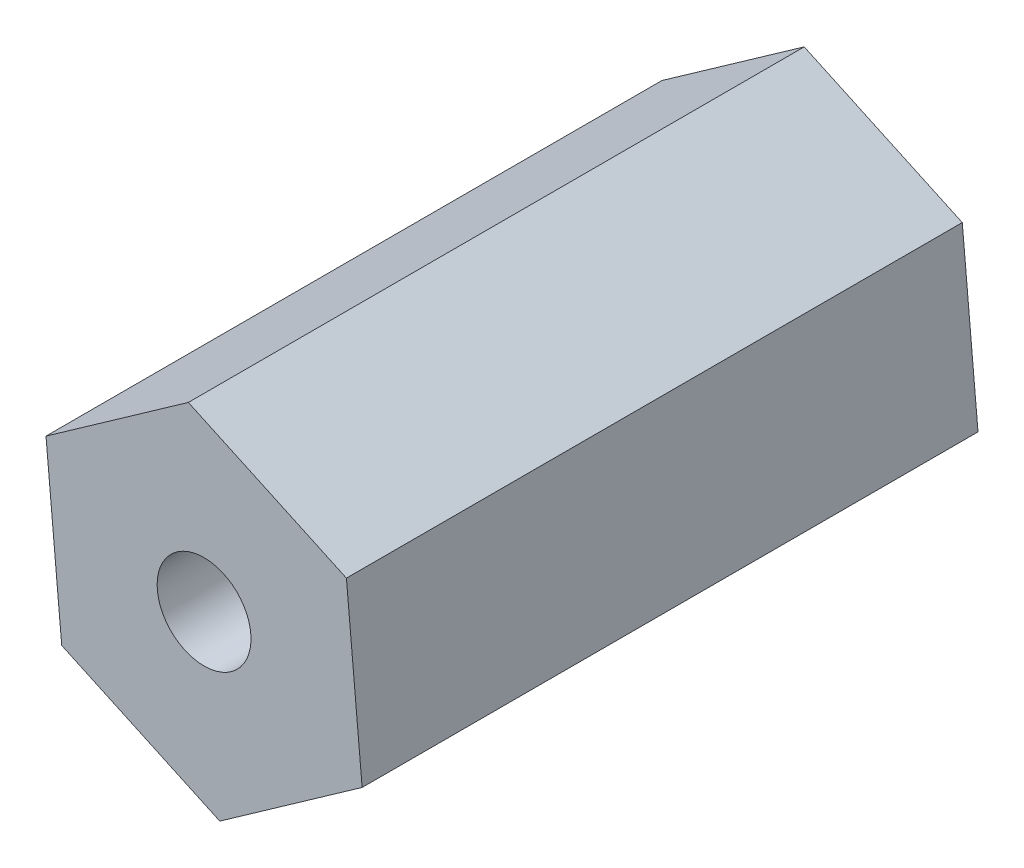
ISO-10303-21;
HEADER;
FILE_DESCRIPTION(('STEP AP214'),'2;1');
FILE_NAME('part.step','',(''),(''),'','','');
FILE_SCHEMA(('AUTOMOTIVE_DESIGN { 1 0 10303 214 1 1 1 1 }'));
ENDSEC;
DATA;
#1=APPLICATION_CONTEXT('core data for automotive mechanical design processes');
#2=APPLICATION_PROTOCOL_DEFINITION('international standard','automotive_design',2000,#1);
#3=PRODUCT_CONTEXT('',#1,'mechanical');
#4=PRODUCT('Part','Part','',(#3));
#5=PRODUCT_RELATED_PRODUCT_CATEGORY('part','',(#4));
#6=PRODUCT_DEFINITION_FORMATION('','',#4);
#7=PRODUCT_DEFINITION_CONTEXT('part definition',#1,'design');
#8=PRODUCT_DEFINITION('design','',#6,#7);
#9=PRODUCT_DEFINITION_SHAPE('','',#8);
#10=(LENGTH_UNIT() NAMED_UNIT(*) SI_UNIT(.MILLI.,.METRE.));
#11=(NAMED_UNIT(*) PLANE_ANGLE_UNIT() SI_UNIT($,.RADIAN.));
#12=(NAMED_UNIT(*) SI_UNIT($,.STERADIAN.) SOLID_ANGLE_UNIT());
#13=UNCERTAINTY_MEASURE_WITH_UNIT(LENGTH_MEASURE(1.E-05),#10,'distance_accuracy_value','');
#14=(GEOMETRIC_REPRESENTATION_CONTEXT(3) GLOBAL_UNCERTAINTY_ASSIGNED_CONTEXT((#13)) GLOBAL_UNIT_ASSIGNED_CONTEXT((#10,
#11,#12)) REPRESENTATION_CONTEXT('',''));
#15=CARTESIAN_POINT('',(0.,0.,0.));
#16=DIRECTION('',(0.,0.,1.));
#17=DIRECTION('',(1.,0.,0.));
#18=AXIS2_PLACEMENT_3D('',#15,#16,#17);
#19=CARTESIAN_POINT('',(1.32877783409409,-14.6646968374165,52.07));
#20=DIRECTION('',(-0.57611094710688,0.817371504656,0.));
#21=DIRECTION('',(-0.817371504656,-0.57611094710688,0.));
#22=AXIS2_PLACEMENT_3D('',#19,#20,#21);
#23=PLANE('',#22);
#24=DIRECTION('',(0.817371504656,0.57611094710688,0.));
#25=VECTOR('',#24,1.);
#26=CARTESIAN_POINT('',(1.32877783409409,-14.6646968374165,0.));
#27=LINE('',#26,#25);
#28=CARTESIAN_POINT('',(1.32877783409409,-14.6646968374165,0.));
#29=VERTEX_POINT('',#28);
#30=CARTESIAN_POINT('',(13.364388917047,-6.18159305839709,0.));
#31=VERTEX_POINT('',#30);
#32=EDGE_CURVE('E119',#29,#31,#27,.T.);
#33=ORIENTED_EDGE('',*,*,#32,.T.);
#34=DIRECTION('',(0.,0.,-1.));
#35=VECTOR('',#34,1.);
#36=CARTESIAN_POINT('',(13.364388917047,-6.18159305839709,52.07));
#37=LINE('',#36,#35);
#38=CARTESIAN_POINT('',(13.364388917047,-6.18159305839709,52.07));
#39=VERTEX_POINT('',#38);
#40=EDGE_CURVE('E11',#39,#31,#37,.T.);
#41=ORIENTED_EDGE('',*,*,#40,.F.);
#42=DIRECTION('',(0.817371504656,0.57611094710688,0.));
#43=VECTOR('',#42,1.);
#44=CARTESIAN_POINT('',(1.32877783409409,-14.6646968374165,52.07));
#45=LINE('',#44,#43);
#46=CARTESIAN_POINT('',(1.32877783409409,-14.6646968374165,52.07));
#47=VERTEX_POINT('',#46);
#48=EDGE_CURVE('E130',#47,#39,#45,.T.);
#49=ORIENTED_EDGE('',*,*,#48,.F.);
#50=DIRECTION('',(0.,0.,-1.));
#51=VECTOR('',#50,1.);
#52=CARTESIAN_POINT('',(1.32877783409409,-14.6646968374165,52.07));
#53=LINE('',#52,#51);
#54=EDGE_CURVE('E115',#47,#29,#53,.T.);
#55=ORIENTED_EDGE('',*,*,#54,.T.);
#56=EDGE_LOOP('',(#33,#41,#49,#55));
#57=FACE_BOUND('',#56,.T.);
#58=ADVANCED_FACE('F35',(#57),#23,.F.);
#59=CARTESIAN_POINT('',(13.364388917047,-6.18159305839709,52.07));
#60=DIRECTION('',(-0.995919960915047,-0.0902409632648711,0.));
#61=DIRECTION('',(0.0902409632648711,-0.995919960915047,0.));
#62=AXIS2_PLACEMENT_3D('',#59,#60,#61);
#63=PLANE('',#62);
#64=DIRECTION('',(-0.0902409632648711,0.995919960915047,0.));
#65=VECTOR('',#64,1.);
#66=CARTESIAN_POINT('',(13.364388917047,-6.18159305839709,0.));
#67=LINE('',#66,#65);
#68=CARTESIAN_POINT('',(12.035611082953,8.48310377901941,0.));
#69=VERTEX_POINT('',#68);
#70=EDGE_CURVE('E122',#31,#69,#67,.T.);
#71=ORIENTED_EDGE('',*,*,#70,.T.);
#72=DIRECTION('',(0.,0.,-1.));
#73=VECTOR('',#72,1.);
#74=CARTESIAN_POINT('',(12.035611082953,8.48310377901941,52.07));
#75=LINE('',#74,#73);
#76=CARTESIAN_POINT('',(12.035611082953,8.48310377901941,52.07));
#77=VERTEX_POINT('',#76);
#78=EDGE_CURVE('E43',#77,#69,#75,.T.);
#79=ORIENTED_EDGE('',*,*,#78,.F.);
#80=DIRECTION('',(-0.0902409632648711,0.995919960915047,0.));
#81=VECTOR('',#80,1.);
#82=CARTESIAN_POINT('',(13.364388917047,-6.18159305839709,52.07));
#83=LINE('',#82,#81);
#84=EDGE_CURVE('E88',#39,#77,#83,.T.);
#85=ORIENTED_EDGE('',*,*,#84,.F.);
#86=ORIENTED_EDGE('',*,*,#40,.T.);
#87=EDGE_LOOP('',(#71,#79,#85,#86));
#88=FACE_BOUND('',#87,.T.);
#89=ADVANCED_FACE('F155',(#88),#63,.F.);
#90=CARTESIAN_POINT('',(12.035611082953,8.48310377901941,52.07));
#91=DIRECTION('',(-0.419809013808167,-0.907612467920871,0.));
#92=DIRECTION('',(0.907612467920871,-0.419809013808167,0.));
#93=AXIS2_PLACEMENT_3D('',#90,#91,#92);
#94=PLANE('',#93);
#95=DIRECTION('',(-0.907612467920871,0.419809013808167,0.));
#96=VECTOR('',#95,1.);
#97=CARTESIAN_POINT('',(12.035611082953,8.48310377901941,0.));
#98=LINE('',#97,#96);
#99=CARTESIAN_POINT('',(-1.3287778340941,14.6646968374165,0.));
#100=VERTEX_POINT('',#99);
#101=EDGE_CURVE('E125',#69,#100,#98,.T.);
#102=ORIENTED_EDGE('',*,*,#101,.T.);
#103=DIRECTION('',(0.,0.,-1.));
#104=VECTOR('',#103,1.);
#105=CARTESIAN_POINT('',(-1.3287778340941,14.6646968374165,52.07));
#106=LINE('',#105,#104);
#107=CARTESIAN_POINT('',(-1.3287778340941,14.6646968374165,52.07));
#108=VERTEX_POINT('',#107);
#109=EDGE_CURVE('E110',#108,#100,#106,.T.);
#110=ORIENTED_EDGE('',*,*,#109,.F.);
#111=DIRECTION('',(-0.907612467920871,0.419809013808167,0.));
#112=VECTOR('',#111,1.);
#113=CARTESIAN_POINT('',(12.035611082953,8.48310377901941,52.07));
#114=LINE('',#113,#112);
#115=EDGE_CURVE('E101',#77,#108,#114,.T.);
#116=ORIENTED_EDGE('',*,*,#115,.F.);
#117=ORIENTED_EDGE('',*,*,#78,.T.);
#118=EDGE_LOOP('',(#102,#110,#116,#117));
#119=FACE_BOUND('',#118,.T.);
#120=ADVANCED_FACE('F136',(#119),#94,.F.);
#121=CARTESIAN_POINT('',(-1.3287778340941,14.6646968374165,52.07));
#122=DIRECTION('',(0.57611094710688,-0.817371504656,0.));
#123=DIRECTION('',(0.817371504656,0.57611094710688,0.));
#124=AXIS2_PLACEMENT_3D('',#121,#122,#123);
#125=PLANE('',#124);
#126=DIRECTION('',(-0.817371504656,-0.57611094710688,0.));
#127=VECTOR('',#126,1.);
#128=CARTESIAN_POINT('',(-1.3287778340941,14.6646968374165,0.));
#129=LINE('',#128,#127);
#130=CARTESIAN_POINT('',(-13.3643889170471,6.1815930583971,0.));
#131=VERTEX_POINT('',#130);
#132=EDGE_CURVE('E109',#100,#131,#129,.T.);
#133=ORIENTED_EDGE('',*,*,#132,.T.);
#134=DIRECTION('',(0.,0.,-1.));
#135=VECTOR('',#134,1.);
#136=CARTESIAN_POINT('',(-13.3643889170471,6.1815930583971,52.07));
#137=LINE('',#136,#135);
#138=CARTESIAN_POINT('',(-13.3643889170471,6.1815930583971,52.07));
#139=VERTEX_POINT('',#138);
#140=EDGE_CURVE('E106',#139,#131,#137,.T.);
#141=ORIENTED_EDGE('',*,*,#140,.F.);
#142=DIRECTION('',(-0.817371504656,-0.57611094710688,0.));
#143=VECTOR('',#142,1.);
#144=CARTESIAN_POINT('',(-1.3287778340941,14.6646968374165,52.07));
#145=LINE('',#144,#143);
#146=EDGE_CURVE('E95',#108,#139,#145,.T.);
#147=ORIENTED_EDGE('',*,*,#146,.F.);
#148=ORIENTED_EDGE('',*,*,#109,.T.);
#149=EDGE_LOOP('',(#133,#141,#147,#148));
#150=FACE_BOUND('',#149,.T.);
#151=ADVANCED_FACE('F107',(#150),#125,.F.);
#152=CARTESIAN_POINT('',(-13.3643889170471,6.1815930583971,52.07));
#153=DIRECTION('',(0.995919960915047,0.0902409632648709,0.));
#154=DIRECTION('',(-0.0902409632648709,0.995919960915047,0.));
#155=AXIS2_PLACEMENT_3D('',#152,#153,#154);
#156=PLANE('',#155);
#157=DIRECTION('',(0.0902409632648709,-0.995919960915047,0.));
#158=VECTOR('',#157,1.);
#159=CARTESIAN_POINT('',(-13.3643889170471,6.1815930583971,0.));
#160=LINE('',#159,#158);
#161=CARTESIAN_POINT('',(-12.035611082953,-8.4831037790194,0.));
#162=VERTEX_POINT('',#161);
#163=EDGE_CURVE('E74',#131,#162,#160,.T.);
#164=ORIENTED_EDGE('',*,*,#163,.T.);
#165=DIRECTION('',(0.,0.,-1.));
#166=VECTOR('',#165,1.);
#167=CARTESIAN_POINT('',(-12.035611082953,-8.4831037790194,52.07));
#168=LINE('',#167,#166);
#169=CARTESIAN_POINT('',(-12.035611082953,-8.4831037790194,52.07));
#170=VERTEX_POINT('',#169);
#171=EDGE_CURVE('E111',#170,#162,#168,.T.);
#172=ORIENTED_EDGE('',*,*,#171,.F.);
#173=DIRECTION('',(0.0902409632648709,-0.995919960915047,0.));
#174=VECTOR('',#173,1.);
#175=CARTESIAN_POINT('',(-13.3643889170471,6.1815930583971,52.07));
#176=LINE('',#175,#174);
#177=EDGE_CURVE('E99',#139,#170,#176,.T.);
#178=ORIENTED_EDGE('',*,*,#177,.F.);
#179=ORIENTED_EDGE('',*,*,#140,.T.);
#180=EDGE_LOOP('',(#164,#172,#178,#179));
#181=FACE_BOUND('',#180,.T.);
#182=ADVANCED_FACE('F113',(#181),#156,.F.);
#183=CARTESIAN_POINT('',(-12.035611082953,-8.4831037790194,52.07));
#184=DIRECTION('',(0.419809013808167,0.907612467920871,0.));
#185=DIRECTION('',(-0.907612467920871,0.419809013808167,0.));
#186=AXIS2_PLACEMENT_3D('',#183,#184,#185);
#187=PLANE('',#186);
#188=DIRECTION('',(0.907612467920871,-0.419809013808167,0.));
#189=VECTOR('',#188,1.);
#190=CARTESIAN_POINT('',(-12.035611082953,-8.4831037790194,0.));
#191=LINE('',#190,#189);
#192=EDGE_CURVE('E80',#162,#29,#191,.T.);
#193=ORIENTED_EDGE('',*,*,#192,.T.);
#194=ORIENTED_EDGE('',*,*,#54,.F.);
#195=DIRECTION('',(0.907612467920871,-0.419809013808167,0.));
#196=VECTOR('',#195,1.);
#197=CARTESIAN_POINT('',(-12.035611082953,-8.4831037790194,52.07));
#198=LINE('',#197,#196);
#199=EDGE_CURVE('E51',#170,#47,#198,.T.);
#200=ORIENTED_EDGE('',*,*,#199,.F.);
#201=ORIENTED_EDGE('',*,*,#171,.T.);
#202=EDGE_LOOP('',(#193,#194,#200,#201));
#203=FACE_BOUND('',#202,.T.);
#204=ADVANCED_FACE('F143',(#203),#187,.F.);
#205=CARTESIAN_POINT('',(0.,0.,52.07));
#206=DIRECTION('',(0.,0.,1.));
#207=DIRECTION('',(1.,0.,0.));
#208=AXIS2_PLACEMENT_3D('',#205,#206,#207);
#209=PLANE('',#208);
#210=CARTESIAN_POINT('',(0.,0.,52.07));
#211=DIRECTION('',(0.,0.,-1.));
#212=DIRECTION('',(-1.,0.,0.));
#213=AXIS2_PLACEMENT_3D('',#210,#211,#212);
#214=CIRCLE('',#213,3.96875);
#215=CARTESIAN_POINT('',(-3.96875,0.,52.07));
#216=VERTEX_POINT('',#215);
#217=EDGE_CURVE('E123',#216,#216,#214,.T.);
#218=ORIENTED_EDGE('',*,*,#217,.T.);
#219=EDGE_LOOP('',(#218));
#220=FACE_BOUND('',#219,.T.);
#221=ORIENTED_EDGE('',*,*,#48,.T.);
#222=ORIENTED_EDGE('',*,*,#84,.T.);
#223=ORIENTED_EDGE('',*,*,#115,.T.);
#224=ORIENTED_EDGE('',*,*,#146,.T.);
#225=ORIENTED_EDGE('',*,*,#177,.T.);
#226=ORIENTED_EDGE('',*,*,#199,.T.);
#227=EDGE_LOOP('',(#221,#222,#223,#224,#225,#226));
#228=FACE_BOUND('',#227,.T.);
#229=ADVANCED_FACE('F97',(#220,#228),#209,.T.);
#230=CARTESIAN_POINT('',(0.,0.,0.));
#231=DIRECTION('',(0.,0.,1.));
#232=DIRECTION('',(1.,0.,0.));
#233=AXIS2_PLACEMENT_3D('',#230,#231,#232);
#234=PLANE('',#233);
#235=CARTESIAN_POINT('',(0.,0.,0.));
#236=DIRECTION('',(0.,0.,-1.));
#237=DIRECTION('',(-1.,0.,0.));
#238=AXIS2_PLACEMENT_3D('',#235,#236,#237);
#239=CIRCLE('',#238,5.3975);
#240=CARTESIAN_POINT('',(-5.3975,0.,0.));
#241=VERTEX_POINT('',#240);
#242=EDGE_CURVE('E223',#241,#241,#239,.T.);
#243=ORIENTED_EDGE('',*,*,#242,.F.);
#244=EDGE_LOOP('',(#243));
#245=FACE_BOUND('',#244,.T.);
#246=ORIENTED_EDGE('',*,*,#32,.F.);
#247=ORIENTED_EDGE('',*,*,#192,.F.);
#248=ORIENTED_EDGE('',*,*,#163,.F.);
#249=ORIENTED_EDGE('',*,*,#132,.F.);
#250=ORIENTED_EDGE('',*,*,#101,.F.);
#251=ORIENTED_EDGE('',*,*,#70,.F.);
#252=EDGE_LOOP('',(#246,#247,#248,#249,#250,#251));
#253=FACE_BOUND('',#252,.T.);
#254=ADVANCED_FACE('F139',(#245,#253),#234,.F.);
#255=CARTESIAN_POINT('',(0.,0.,0.));
#256=DIRECTION('',(0.,0.,-1.));
#257=DIRECTION('',(-1.,0.,0.));
#258=AXIS2_PLACEMENT_3D('',#255,#256,#257);
#259=CYLINDRICAL_SURFACE('',#258,3.96875);
#260=ORIENTED_EDGE('',*,*,#217,.F.);
#261=EDGE_LOOP('',(#260));
#262=FACE_BOUND('',#261,.T.);
#263=CARTESIAN_POINT('',(0.,0.,1.42874999999965));
#264=DIRECTION('',(0.,0.,-1.));
#265=DIRECTION('',(-1.,0.,0.));
#266=AXIS2_PLACEMENT_3D('',#263,#264,#265);
#267=CIRCLE('',#266,3.96875);
#268=CARTESIAN_POINT('',(-3.96875,0.,1.42874999999965));
#269=VERTEX_POINT('',#268);
#270=EDGE_CURVE('E220',#269,#269,#267,.T.);
#271=ORIENTED_EDGE('',*,*,#270,.T.);
#272=EDGE_LOOP('',(#271));
#273=FACE_BOUND('',#272,.T.);
#274=ADVANCED_FACE('F192',(#262,#273),#259,.F.);
#275=CARTESIAN_POINT('',(0.,0.,0.));
#276=DIRECTION('',(0.,0.,-1.));
#277=DIRECTION('',(-1.,0.,0.));
#278=AXIS2_PLACEMENT_3D('',#275,#276,#277);
#279=CONICAL_SURFACE('',#278,5.3975,0.785398163397572);
#280=ORIENTED_EDGE('',*,*,#270,.F.);
#281=EDGE_LOOP('',(#280));
#282=FACE_BOUND('',#281,.T.);
#283=ORIENTED_EDGE('',*,*,#242,.T.);
#284=EDGE_LOOP('',(#283));
#285=FACE_BOUND('',#284,.T.);
#286=ADVANCED_FACE('F202',(#282,#285),#279,.F.);
#287=CLOSED_SHELL('',(#58,#89,#120,#151,#182,#204,#229,#254,#274,#286));
#288=MANIFOLD_SOLID_BREP('B2',#287);
#289=ADVANCED_BREP_SHAPE_REPRESENTATION('',(#18,#288),#14);
#290=SHAPE_DEFINITION_REPRESENTATION(#9,#289);
ENDSEC;
END-ISO-10303-21;
